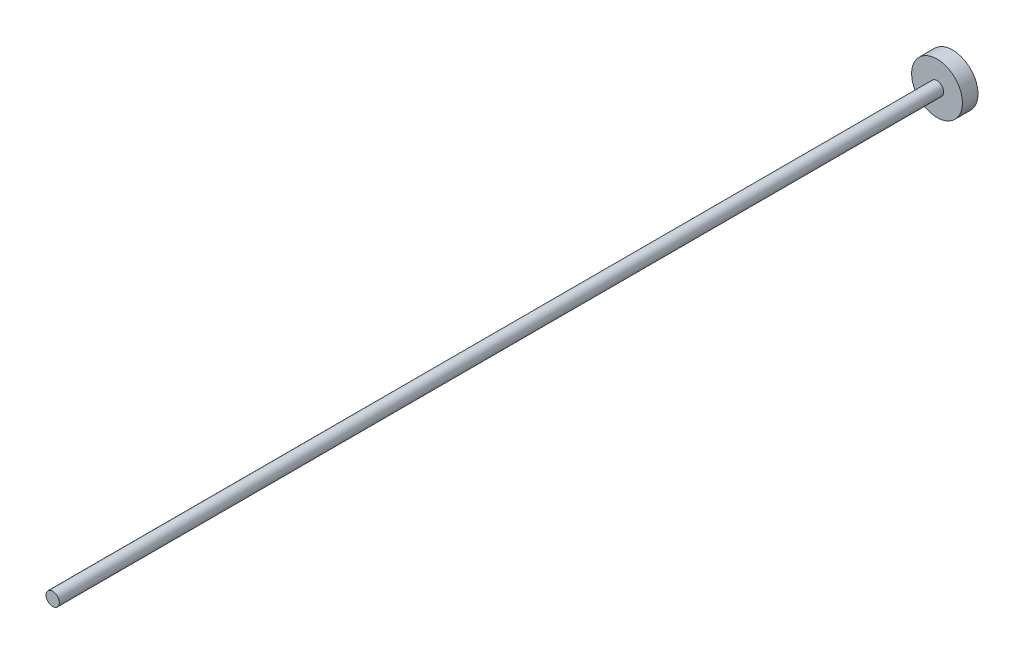
ISO-10303-21;
HEADER;
FILE_DESCRIPTION(('STEP AP214'),'2;1');
FILE_NAME('part.step','',(''),(''),'','','');
FILE_SCHEMA(('AUTOMOTIVE_DESIGN { 1 0 10303 214 1 1 1 1 }'));
ENDSEC;
DATA;
#1=APPLICATION_CONTEXT('core data for automotive mechanical design processes');
#2=APPLICATION_PROTOCOL_DEFINITION('international standard','automotive_design',2000,#1);
#3=PRODUCT_CONTEXT('',#1,'mechanical');
#4=PRODUCT('Part','Part','',(#3));
#5=PRODUCT_RELATED_PRODUCT_CATEGORY('part','',(#4));
#6=PRODUCT_DEFINITION_FORMATION('','',#4);
#7=PRODUCT_DEFINITION_CONTEXT('part definition',#1,'design');
#8=PRODUCT_DEFINITION('design','',#6,#7);
#9=PRODUCT_DEFINITION_SHAPE('','',#8);
#10=(LENGTH_UNIT() NAMED_UNIT(*) SI_UNIT(.MILLI.,.METRE.));
#11=(NAMED_UNIT(*) PLANE_ANGLE_UNIT() SI_UNIT($,.RADIAN.));
#12=(NAMED_UNIT(*) SI_UNIT($,.STERADIAN.) SOLID_ANGLE_UNIT());
#13=UNCERTAINTY_MEASURE_WITH_UNIT(LENGTH_MEASURE(1.E-05),#10,'distance_accuracy_value','');
#14=(GEOMETRIC_REPRESENTATION_CONTEXT(3) GLOBAL_UNCERTAINTY_ASSIGNED_CONTEXT((#13)) GLOBAL_UNIT_ASSIGNED_CONTEXT((#10,
#11,#12)) REPRESENTATION_CONTEXT('',''));
#15=CARTESIAN_POINT('',(0.,0.,0.));
#16=DIRECTION('',(0.,0.,1.));
#17=DIRECTION('',(1.,0.,0.));
#18=AXIS2_PLACEMENT_3D('',#15,#16,#17);
#19=CARTESIAN_POINT('',(0.,0.,1.5));
#20=DIRECTION('',(0.,0.,-1.));
#21=DIRECTION('',(-1.,0.,0.));
#22=AXIS2_PLACEMENT_3D('',#19,#20,#21);
#23=CYLINDRICAL_SURFACE('',#22,2.44);
#24=CARTESIAN_POINT('',(0.,0.,1.5));
#25=DIRECTION('',(0.,0.,1.));
#26=DIRECTION('',(1.,0.,0.));
#27=AXIS2_PLACEMENT_3D('',#24,#25,#26);
#28=CIRCLE('',#27,2.44);
#29=CARTESIAN_POINT('',(2.44,0.,1.5));
#30=VERTEX_POINT('',#29);
#31=EDGE_CURVE('E45',#30,#30,#28,.T.);
#32=ORIENTED_EDGE('',*,*,#31,.F.);
#33=EDGE_LOOP('',(#32));
#34=FACE_BOUND('',#33,.T.);
#35=CARTESIAN_POINT('',(0.,0.,0.));
#36=DIRECTION('',(0.,0.,1.));
#37=DIRECTION('',(1.,0.,0.));
#38=AXIS2_PLACEMENT_3D('',#35,#36,#37);
#39=CIRCLE('',#38,2.44);
#40=CARTESIAN_POINT('',(2.44,0.,0.));
#41=VERTEX_POINT('',#40);
#42=EDGE_CURVE('E40',#41,#41,#39,.T.);
#43=ORIENTED_EDGE('',*,*,#42,.T.);
#44=EDGE_LOOP('',(#43));
#45=FACE_BOUND('',#44,.T.);
#46=ADVANCED_FACE('F37',(#34,#45),#23,.T.);
#47=CARTESIAN_POINT('',(0.,0.,1.5));
#48=DIRECTION('',(0.,0.,1.));
#49=DIRECTION('',(1.,0.,0.));
#50=AXIS2_PLACEMENT_3D('',#47,#48,#49);
#51=PLANE('',#50);
#52=CARTESIAN_POINT('',(0.,0.,1.5));
#53=DIRECTION('',(0.,0.,1.));
#54=DIRECTION('',(1.,0.,0.));
#55=AXIS2_PLACEMENT_3D('',#52,#53,#54);
#56=CIRCLE('',#55,0.64);
#57=CARTESIAN_POINT('',(0.64,0.,1.5));
#58=VERTEX_POINT('',#57);
#59=EDGE_CURVE('E10',#58,#58,#56,.T.);
#60=ORIENTED_EDGE('',*,*,#59,.F.);
#61=EDGE_LOOP('',(#60));
#62=FACE_BOUND('',#61,.T.);
#63=ORIENTED_EDGE('',*,*,#31,.T.);
#64=EDGE_LOOP('',(#63));
#65=FACE_BOUND('',#64,.T.);
#66=ADVANCED_FACE('F65',(#62,#65),#51,.T.);
#67=CARTESIAN_POINT('',(0.,0.,0.));
#68=DIRECTION('',(0.,0.,1.));
#69=DIRECTION('',(1.,0.,0.));
#70=AXIS2_PLACEMENT_3D('',#67,#68,#69);
#71=PLANE('',#70);
#72=ORIENTED_EDGE('',*,*,#42,.F.);
#73=EDGE_LOOP('',(#72));
#74=FACE_BOUND('',#73,.T.);
#75=ADVANCED_FACE('F62',(#74),#71,.F.);
#76=CARTESIAN_POINT('',(0.,0.,86.5));
#77=DIRECTION('',(0.,0.,-1.));
#78=DIRECTION('',(-1.,0.,0.));
#79=AXIS2_PLACEMENT_3D('',#76,#77,#78);
#80=CYLINDRICAL_SURFACE('',#79,0.64);
#81=CARTESIAN_POINT('',(0.,0.,86.5));
#82=DIRECTION('',(0.,0.,1.));
#83=DIRECTION('',(1.,0.,0.));
#84=AXIS2_PLACEMENT_3D('',#81,#82,#83);
#85=CIRCLE('',#84,0.64);
#86=CARTESIAN_POINT('',(0.64,0.,86.5));
#87=VERTEX_POINT('',#86);
#88=EDGE_CURVE('E52',#87,#87,#85,.T.);
#89=ORIENTED_EDGE('',*,*,#88,.F.);
#90=EDGE_LOOP('',(#89));
#91=FACE_BOUND('',#90,.T.);
#92=ORIENTED_EDGE('',*,*,#59,.T.);
#93=EDGE_LOOP('',(#92));
#94=FACE_BOUND('',#93,.T.);
#95=ADVANCED_FACE('F64',(#91,#94),#80,.T.);
#96=CARTESIAN_POINT('',(0.,0.,86.5));
#97=DIRECTION('',(0.,0.,1.));
#98=DIRECTION('',(1.,0.,0.));
#99=AXIS2_PLACEMENT_3D('',#96,#97,#98);
#100=PLANE('',#99);
#101=ORIENTED_EDGE('',*,*,#88,.T.);
#102=EDGE_LOOP('',(#101));
#103=FACE_BOUND('',#102,.T.);
#104=ADVANCED_FACE('F70',(#103),#100,.T.);
#105=CLOSED_SHELL('',(#46,#66,#75,#95,#104));
#106=MANIFOLD_SOLID_BREP('B2',#105);
#107=ADVANCED_BREP_SHAPE_REPRESENTATION('',(#18,#106),#14);
#108=SHAPE_DEFINITION_REPRESENTATION(#9,#107);
ENDSEC;
END-ISO-10303-21;
